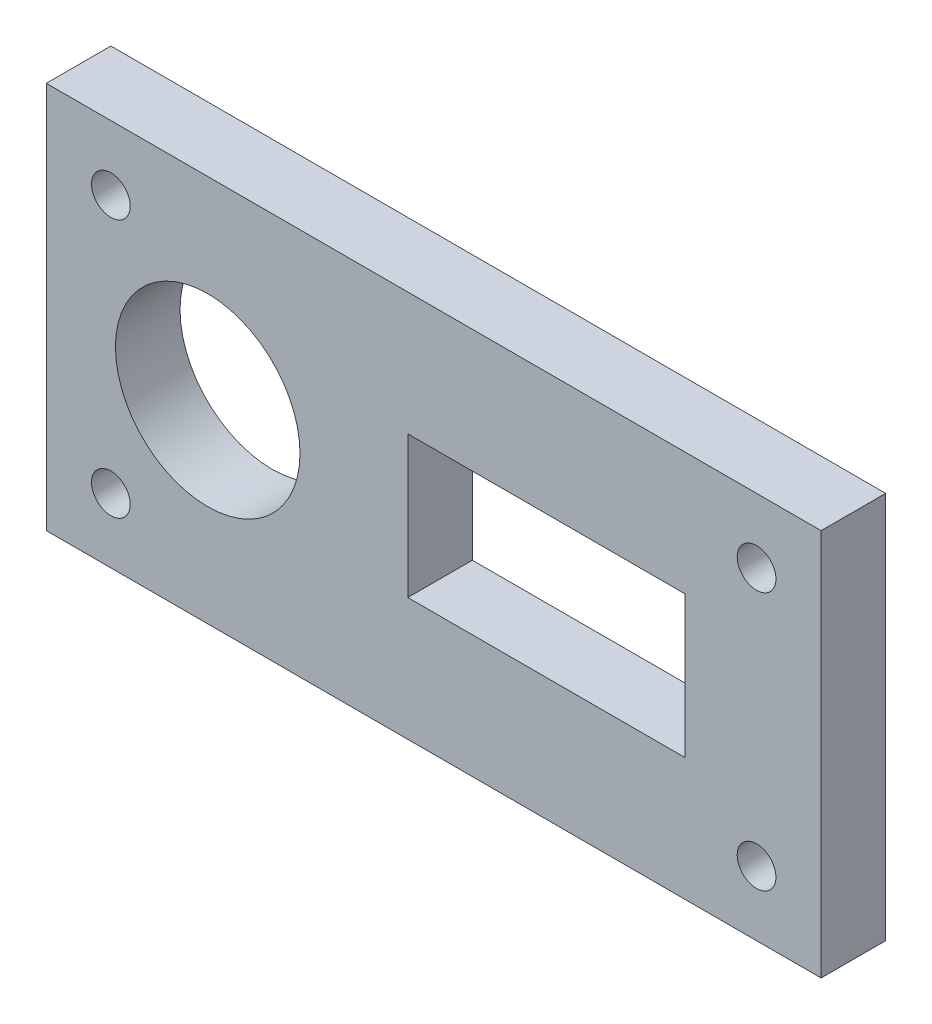
ISO-10303-21;
HEADER;
FILE_DESCRIPTION(('STEP AP214'),'2;1');
FILE_NAME('part.step','',(''),(''),'','','');
FILE_SCHEMA(('AUTOMOTIVE_DESIGN { 1 0 10303 214 1 1 1 1 }'));
ENDSEC;
DATA;
#1=APPLICATION_CONTEXT('core data for automotive mechanical design processes');
#2=APPLICATION_PROTOCOL_DEFINITION('international standard','automotive_design',2000,#1);
#3=PRODUCT_CONTEXT('',#1,'mechanical');
#4=PRODUCT('Part','Part','',(#3));
#5=PRODUCT_RELATED_PRODUCT_CATEGORY('part','',(#4));
#6=PRODUCT_DEFINITION_FORMATION('','',#4);
#7=PRODUCT_DEFINITION_CONTEXT('part definition',#1,'design');
#8=PRODUCT_DEFINITION('design','',#6,#7);
#9=PRODUCT_DEFINITION_SHAPE('','',#8);
#10=(LENGTH_UNIT() NAMED_UNIT(*) SI_UNIT(.MILLI.,.METRE.));
#11=(NAMED_UNIT(*) PLANE_ANGLE_UNIT() SI_UNIT($,.RADIAN.));
#12=(NAMED_UNIT(*) SI_UNIT($,.STERADIAN.) SOLID_ANGLE_UNIT());
#13=UNCERTAINTY_MEASURE_WITH_UNIT(LENGTH_MEASURE(1.E-05),#10,'distance_accuracy_value','');
#14=(GEOMETRIC_REPRESENTATION_CONTEXT(3) GLOBAL_UNCERTAINTY_ASSIGNED_CONTEXT((#13)) GLOBAL_UNIT_ASSIGNED_CONTEXT((#10,
#11,#12)) REPRESENTATION_CONTEXT('',''));
#15=CARTESIAN_POINT('',(0.,0.,0.));
#16=DIRECTION('',(0.,0.,1.));
#17=DIRECTION('',(1.,0.,0.));
#18=AXIS2_PLACEMENT_3D('',#15,#16,#17);
#19=CARTESIAN_POINT('',(60.,-30.,10.));
#20=DIRECTION('',(-1.,0.,0.));
#21=DIRECTION('',(0.,0.,1.));
#22=AXIS2_PLACEMENT_3D('',#19,#20,#21);
#23=PLANE('',#22);
#24=DIRECTION('',(0.,1.,0.));
#25=VECTOR('',#24,1.);
#26=CARTESIAN_POINT('',(60.,-30.,0.));
#27=LINE('',#26,#25);
#28=CARTESIAN_POINT('',(60.,-30.,0.));
#29=VERTEX_POINT('',#28);
#30=CARTESIAN_POINT('',(60.,30.,0.));
#31=VERTEX_POINT('',#30);
#32=EDGE_CURVE('E122',#29,#31,#27,.T.);
#33=ORIENTED_EDGE('',*,*,#32,.T.);
#34=DIRECTION('',(0.,0.,-1.));
#35=VECTOR('',#34,1.);
#36=CARTESIAN_POINT('',(60.,30.,10.));
#37=LINE('',#36,#35);
#38=CARTESIAN_POINT('',(60.,30.,10.));
#39=VERTEX_POINT('',#38);
#40=EDGE_CURVE('E11',#39,#31,#37,.T.);
#41=ORIENTED_EDGE('',*,*,#40,.F.);
#42=DIRECTION('',(0.,1.,0.));
#43=VECTOR('',#42,1.);
#44=CARTESIAN_POINT('',(60.,-30.,10.));
#45=LINE('',#44,#43);
#46=CARTESIAN_POINT('',(60.,-30.,10.));
#47=VERTEX_POINT('',#46);
#48=EDGE_CURVE('E123',#47,#39,#45,.T.);
#49=ORIENTED_EDGE('',*,*,#48,.F.);
#50=DIRECTION('',(0.,0.,-1.));
#51=VECTOR('',#50,1.);
#52=CARTESIAN_POINT('',(60.,-30.,10.));
#53=LINE('',#52,#51);
#54=EDGE_CURVE('E46',#47,#29,#53,.T.);
#55=ORIENTED_EDGE('',*,*,#54,.T.);
#56=EDGE_LOOP('',(#33,#41,#49,#55));
#57=FACE_BOUND('',#56,.T.);
#58=ADVANCED_FACE('F39',(#57),#23,.F.);
#59=CARTESIAN_POINT('',(-60.,30.,10.));
#60=DIRECTION('',(0.,-1.,0.));
#61=DIRECTION('',(0.,0.,-1.));
#62=AXIS2_PLACEMENT_3D('',#59,#60,#61);
#63=PLANE('',#62);
#64=DIRECTION('',(-1.,0.,0.));
#65=VECTOR('',#64,1.);
#66=CARTESIAN_POINT('',(-60.,30.,0.));
#67=LINE('',#66,#65);
#68=CARTESIAN_POINT('',(-60.0000000000003,30.,0.));
#69=VERTEX_POINT('',#68);
#70=EDGE_CURVE('E124',#31,#69,#67,.T.);
#71=ORIENTED_EDGE('',*,*,#70,.T.);
#72=DIRECTION('',(0.,0.,1.));
#73=VECTOR('',#72,1.);
#74=CARTESIAN_POINT('',(-60.0000000000003,30.,0.));
#75=LINE('',#74,#73);
#76=CARTESIAN_POINT('',(-60.0000000000003,30.,10.));
#77=VERTEX_POINT('',#76);
#78=EDGE_CURVE('E53',#69,#77,#75,.T.);
#79=ORIENTED_EDGE('',*,*,#78,.T.);
#80=DIRECTION('',(-1.,0.,0.));
#81=VECTOR('',#80,1.);
#82=CARTESIAN_POINT('',(-60.,30.,10.));
#83=LINE('',#82,#81);
#84=EDGE_CURVE('E127',#39,#77,#83,.T.);
#85=ORIENTED_EDGE('',*,*,#84,.F.);
#86=ORIENTED_EDGE('',*,*,#40,.T.);
#87=EDGE_LOOP('',(#71,#79,#85,#86));
#88=FACE_BOUND('',#87,.T.);
#89=ADVANCED_FACE('F257',(#88),#63,.F.);
#90=CARTESIAN_POINT('',(-60.,-30.,10.));
#91=DIRECTION('',(0.,1.,0.));
#92=DIRECTION('',(0.,0.,1.));
#93=AXIS2_PLACEMENT_3D('',#90,#91,#92);
#94=PLANE('',#93);
#95=DIRECTION('',(1.,0.,0.));
#96=VECTOR('',#95,1.);
#97=CARTESIAN_POINT('',(-60.,-30.,10.));
#98=LINE('',#97,#96);
#99=CARTESIAN_POINT('',(-60.0000000000003,-30.,10.));
#100=VERTEX_POINT('',#99);
#101=EDGE_CURVE('E116',#100,#47,#98,.T.);
#102=ORIENTED_EDGE('',*,*,#101,.F.);
#103=DIRECTION('',(0.,0.,1.));
#104=VECTOR('',#103,1.);
#105=CARTESIAN_POINT('',(-60.0000000000003,-30.,0.));
#106=LINE('',#105,#104);
#107=CARTESIAN_POINT('',(-60.0000000000003,-30.,0.));
#108=VERTEX_POINT('',#107);
#109=EDGE_CURVE('E103',#108,#100,#106,.T.);
#110=ORIENTED_EDGE('',*,*,#109,.F.);
#111=DIRECTION('',(1.,0.,0.));
#112=VECTOR('',#111,1.);
#113=CARTESIAN_POINT('',(-60.,-30.,0.));
#114=LINE('',#113,#112);
#115=EDGE_CURVE('E114',#108,#29,#114,.T.);
#116=ORIENTED_EDGE('',*,*,#115,.T.);
#117=ORIENTED_EDGE('',*,*,#54,.F.);
#118=EDGE_LOOP('',(#102,#110,#116,#117));
#119=FACE_BOUND('',#118,.T.);
#120=ADVANCED_FACE('F112',(#119),#94,.F.);
#121=CARTESIAN_POINT('',(0.,0.,10.));
#122=DIRECTION('',(0.,0.,-1.));
#123=DIRECTION('',(-1.,0.,0.));
#124=AXIS2_PLACEMENT_3D('',#121,#122,#123);
#125=PLANE('',#124);
#126=CARTESIAN_POINT('',(50.0000000000017,-19.9999999999999,10.));
#127=DIRECTION('',(0.,0.,-1.));
#128=DIRECTION('',(-1.,0.,0.));
#129=AXIS2_PLACEMENT_3D('',#126,#127,#128);
#130=CIRCLE('',#129,3.);
#131=CARTESIAN_POINT('',(47.0000000000017,-19.9999999999999,10.));
#132=VERTEX_POINT('',#131);
#133=EDGE_CURVE('E213',#132,#132,#130,.T.);
#134=ORIENTED_EDGE('',*,*,#133,.T.);
#135=EDGE_LOOP('',(#134));
#136=FACE_BOUND('',#135,.T.);
#137=CARTESIAN_POINT('',(-49.9999999999983,-19.9999999999999,10.));
#138=DIRECTION('',(0.,0.,-1.));
#139=DIRECTION('',(-1.,0.,0.));
#140=AXIS2_PLACEMENT_3D('',#137,#138,#139);
#141=CIRCLE('',#140,3.);
#142=CARTESIAN_POINT('',(-52.9999999999983,-19.9999999999999,10.));
#143=VERTEX_POINT('',#142);
#144=EDGE_CURVE('E219',#143,#143,#141,.T.);
#145=ORIENTED_EDGE('',*,*,#144,.T.);
#146=EDGE_LOOP('',(#145));
#147=FACE_BOUND('',#146,.T.);
#148=CARTESIAN_POINT('',(-49.9999999999983,20.0000000000001,10.));
#149=DIRECTION('',(0.,0.,-1.));
#150=DIRECTION('',(-1.,0.,0.));
#151=AXIS2_PLACEMENT_3D('',#148,#149,#150);
#152=CIRCLE('',#151,3.);
#153=CARTESIAN_POINT('',(-52.9999999999983,20.0000000000001,10.));
#154=VERTEX_POINT('',#153);
#155=EDGE_CURVE('E207',#154,#154,#152,.T.);
#156=ORIENTED_EDGE('',*,*,#155,.T.);
#157=EDGE_LOOP('',(#156));
#158=FACE_BOUND('',#157,.T.);
#159=CARTESIAN_POINT('',(50.0000000000017,20.0000000000001,10.));
#160=DIRECTION('',(0.,0.,-1.));
#161=DIRECTION('',(-1.,0.,0.));
#162=AXIS2_PLACEMENT_3D('',#159,#160,#161);
#163=CIRCLE('',#162,3.);
#164=CARTESIAN_POINT('',(47.0000000000017,20.0000000000001,10.));
#165=VERTEX_POINT('',#164);
#166=EDGE_CURVE('E202',#165,#165,#163,.T.);
#167=ORIENTED_EDGE('',*,*,#166,.T.);
#168=EDGE_LOOP('',(#167));
#169=FACE_BOUND('',#168,.T.);
#170=DIRECTION('',(-1.,0.,0.));
#171=VECTOR('',#170,1.);
#172=CARTESIAN_POINT('',(38.9394239388569,-10.9786239388569,10.));
#173=LINE('',#172,#171);
#174=CARTESIAN_POINT('',(38.9394239388569,-10.9786239388569,10.));
#175=VERTEX_POINT('',#174);
#176=CARTESIAN_POINT('',(-4.0178239388569,-10.9786239388569,10.));
#177=VERTEX_POINT('',#176);
#178=EDGE_CURVE('E152',#175,#177,#173,.T.);
#179=ORIENTED_EDGE('',*,*,#178,.T.);
#180=DIRECTION('',(0.,1.,0.));
#181=VECTOR('',#180,1.);
#182=CARTESIAN_POINT('',(-4.0178239388569,-10.9786239388569,10.));
#183=LINE('',#182,#181);
#184=CARTESIAN_POINT('',(-4.0178239388569,10.9786239388569,10.));
#185=VERTEX_POINT('',#184);
#186=EDGE_CURVE('E160',#177,#185,#183,.T.);
#187=ORIENTED_EDGE('',*,*,#186,.T.);
#188=DIRECTION('',(1.,0.,0.));
#189=VECTOR('',#188,1.);
#190=CARTESIAN_POINT('',(38.9394239388569,10.9786239388569,10.));
#191=LINE('',#190,#189);
#192=CARTESIAN_POINT('',(38.9394239388569,10.9786239388569,10.));
#193=VERTEX_POINT('',#192);
#194=EDGE_CURVE('E173',#185,#193,#191,.T.);
#195=ORIENTED_EDGE('',*,*,#194,.T.);
#196=DIRECTION('',(0.,-1.,0.));
#197=VECTOR('',#196,1.);
#198=CARTESIAN_POINT('',(38.9394239388569,-10.9786239388569,10.));
#199=LINE('',#198,#197);
#200=EDGE_CURVE('E61',#193,#175,#199,.T.);
#201=ORIENTED_EDGE('',*,*,#200,.T.);
#202=EDGE_LOOP('',(#179,#187,#195,#201));
#203=FACE_BOUND('',#202,.T.);
#204=CARTESIAN_POINT('',(-35.,0.,10.));
#205=DIRECTION('',(0.,0.,1.));
#206=DIRECTION('',(1.,0.,0.));
#207=AXIS2_PLACEMENT_3D('',#204,#205,#206);
#208=CIRCLE('',#207,14.29);
#209=CARTESIAN_POINT('',(-20.71,0.,10.));
#210=VERTEX_POINT('',#209);
#211=EDGE_CURVE('E140',#210,#210,#208,.T.);
#212=ORIENTED_EDGE('',*,*,#211,.F.);
#213=EDGE_LOOP('',(#212));
#214=FACE_BOUND('',#213,.T.);
#215=ORIENTED_EDGE('',*,*,#84,.T.);
#216=DIRECTION('',(0.,1.,0.));
#217=VECTOR('',#216,1.);
#218=CARTESIAN_POINT('',(-60.0000000000003,30.,10.));
#219=LINE('',#218,#217);
#220=EDGE_CURVE('E108',#100,#77,#219,.T.);
#221=ORIENTED_EDGE('',*,*,#220,.F.);
#222=ORIENTED_EDGE('',*,*,#101,.T.);
#223=ORIENTED_EDGE('',*,*,#48,.T.);
#224=EDGE_LOOP('',(#215,#221,#222,#223));
#225=FACE_BOUND('',#224,.T.);
#226=ADVANCED_FACE('F228',(#136,#147,#158,#169,#203,#214,#225),#125,.F.);
#227=CARTESIAN_POINT('',(0.,0.,0.));
#228=DIRECTION('',(0.,0.,-1.));
#229=DIRECTION('',(-1.,0.,0.));
#230=AXIS2_PLACEMENT_3D('',#227,#228,#229);
#231=PLANE('',#230);
#232=CARTESIAN_POINT('',(50.0000000000017,-19.9999999999999,0.));
#233=DIRECTION('',(0.,0.,-1.));
#234=DIRECTION('',(-1.,0.,0.));
#235=AXIS2_PLACEMENT_3D('',#232,#233,#234);
#236=CIRCLE('',#235,3.);
#237=CARTESIAN_POINT('',(47.0000000000017,-19.9999999999999,0.));
#238=VERTEX_POINT('',#237);
#239=EDGE_CURVE('E210',#238,#238,#236,.T.);
#240=ORIENTED_EDGE('',*,*,#239,.F.);
#241=EDGE_LOOP('',(#240));
#242=FACE_BOUND('',#241,.T.);
#243=CARTESIAN_POINT('',(-49.9999999999983,-19.9999999999999,0.));
#244=DIRECTION('',(0.,0.,-1.));
#245=DIRECTION('',(-1.,0.,0.));
#246=AXIS2_PLACEMENT_3D('',#243,#244,#245);
#247=CIRCLE('',#246,3.);
#248=CARTESIAN_POINT('',(-52.9999999999983,-19.9999999999999,0.));
#249=VERTEX_POINT('',#248);
#250=EDGE_CURVE('E216',#249,#249,#247,.T.);
#251=ORIENTED_EDGE('',*,*,#250,.F.);
#252=EDGE_LOOP('',(#251));
#253=FACE_BOUND('',#252,.T.);
#254=CARTESIAN_POINT('',(-49.9999999999983,20.0000000000001,0.));
#255=DIRECTION('',(0.,0.,-1.));
#256=DIRECTION('',(-1.,0.,0.));
#257=AXIS2_PLACEMENT_3D('',#254,#255,#256);
#258=CIRCLE('',#257,3.);
#259=CARTESIAN_POINT('',(-52.9999999999983,20.0000000000001,0.));
#260=VERTEX_POINT('',#259);
#261=EDGE_CURVE('E222',#260,#260,#258,.T.);
#262=ORIENTED_EDGE('',*,*,#261,.F.);
#263=EDGE_LOOP('',(#262));
#264=FACE_BOUND('',#263,.T.);
#265=CARTESIAN_POINT('',(50.0000000000017,20.0000000000001,0.));
#266=DIRECTION('',(0.,0.,-1.));
#267=DIRECTION('',(-1.,0.,0.));
#268=AXIS2_PLACEMENT_3D('',#265,#266,#267);
#269=CIRCLE('',#268,3.);
#270=CARTESIAN_POINT('',(47.0000000000017,20.0000000000001,0.));
#271=VERTEX_POINT('',#270);
#272=EDGE_CURVE('E204',#271,#271,#269,.T.);
#273=ORIENTED_EDGE('',*,*,#272,.F.);
#274=EDGE_LOOP('',(#273));
#275=FACE_BOUND('',#274,.T.);
#276=DIRECTION('',(0.,1.,0.));
#277=VECTOR('',#276,1.);
#278=CARTESIAN_POINT('',(-60.0000000000003,30.,0.));
#279=LINE('',#278,#277);
#280=EDGE_CURVE('E100',#108,#69,#279,.T.);
#281=ORIENTED_EDGE('',*,*,#280,.T.);
#282=ORIENTED_EDGE('',*,*,#70,.F.);
#283=ORIENTED_EDGE('',*,*,#32,.F.);
#284=ORIENTED_EDGE('',*,*,#115,.F.);
#285=EDGE_LOOP('',(#281,#282,#283,#284));
#286=FACE_BOUND('',#285,.T.);
#287=CARTESIAN_POINT('',(41.8608,-4.99999999999999,0.));
#288=DIRECTION('',(0.,0.,-1.));
#289=DIRECTION('',(-1.,0.,0.));
#290=AXIS2_PLACEMENT_3D('',#287,#288,#289);
#291=CIRCLE('',#290,1.5);
#292=CARTESIAN_POINT('',(40.3608,-4.99999999999999,0.));
#293=VERTEX_POINT('',#292);
#294=EDGE_CURVE('E184',#293,#293,#291,.T.);
#295=ORIENTED_EDGE('',*,*,#294,.F.);
#296=EDGE_LOOP('',(#295));
#297=FACE_BOUND('',#296,.T.);
#298=CARTESIAN_POINT('',(-6.9392,-5.,0.));
#299=DIRECTION('',(0.,0.,-1.));
#300=DIRECTION('',(-1.,0.,0.));
#301=AXIS2_PLACEMENT_3D('',#298,#299,#300);
#302=CIRCLE('',#301,1.5);
#303=CARTESIAN_POINT('',(-8.4392,-5.,0.));
#304=VERTEX_POINT('',#303);
#305=EDGE_CURVE('E190',#304,#304,#302,.T.);
#306=ORIENTED_EDGE('',*,*,#305,.F.);
#307=EDGE_LOOP('',(#306));
#308=FACE_BOUND('',#307,.T.);
#309=CARTESIAN_POINT('',(-6.9392,5.,0.));
#310=DIRECTION('',(0.,0.,-1.));
#311=DIRECTION('',(-1.,0.,0.));
#312=AXIS2_PLACEMENT_3D('',#309,#310,#311);
#313=CIRCLE('',#312,1.5);
#314=CARTESIAN_POINT('',(-8.4392,5.,0.));
#315=VERTEX_POINT('',#314);
#316=EDGE_CURVE('E196',#315,#315,#313,.T.);
#317=ORIENTED_EDGE('',*,*,#316,.F.);
#318=EDGE_LOOP('',(#317));
#319=FACE_BOUND('',#318,.T.);
#320=CARTESIAN_POINT('',(41.8608,5.00000000000001,0.));
#321=DIRECTION('',(0.,0.,-1.));
#322=DIRECTION('',(-1.,0.,0.));
#323=AXIS2_PLACEMENT_3D('',#320,#321,#322);
#324=CIRCLE('',#323,1.5);
#325=CARTESIAN_POINT('',(40.3608,5.00000000000001,0.));
#326=VERTEX_POINT('',#325);
#327=EDGE_CURVE('E178',#326,#326,#324,.T.);
#328=ORIENTED_EDGE('',*,*,#327,.F.);
#329=EDGE_LOOP('',(#328));
#330=FACE_BOUND('',#329,.T.);
#331=DIRECTION('',(0.,1.,0.));
#332=VECTOR('',#331,1.);
#333=CARTESIAN_POINT('',(-4.0178239388569,-10.9786239388569,0.));
#334=LINE('',#333,#332);
#335=CARTESIAN_POINT('',(-4.0178239388569,-10.9786239388569,0.));
#336=VERTEX_POINT('',#335);
#337=CARTESIAN_POINT('',(-4.0178239388569,10.9786239388569,0.));
#338=VERTEX_POINT('',#337);
#339=EDGE_CURVE('E167',#336,#338,#334,.T.);
#340=ORIENTED_EDGE('',*,*,#339,.F.);
#341=DIRECTION('',(-1.,0.,0.));
#342=VECTOR('',#341,1.);
#343=CARTESIAN_POINT('',(38.9394239388569,-10.9786239388569,0.));
#344=LINE('',#343,#342);
#345=CARTESIAN_POINT('',(38.9394239388569,-10.9786239388569,0.));
#346=VERTEX_POINT('',#345);
#347=EDGE_CURVE('E157',#346,#336,#344,.T.);
#348=ORIENTED_EDGE('',*,*,#347,.F.);
#349=DIRECTION('',(0.,-1.,0.));
#350=VECTOR('',#349,1.);
#351=CARTESIAN_POINT('',(38.9394239388569,-10.9786239388569,0.));
#352=LINE('',#351,#350);
#353=CARTESIAN_POINT('',(38.9394239388569,10.9786239388569,0.));
#354=VERTEX_POINT('',#353);
#355=EDGE_CURVE('E161',#354,#346,#352,.T.);
#356=ORIENTED_EDGE('',*,*,#355,.F.);
#357=DIRECTION('',(1.,0.,0.));
#358=VECTOR('',#357,1.);
#359=CARTESIAN_POINT('',(38.9394239388569,10.9786239388569,0.));
#360=LINE('',#359,#358);
#361=EDGE_CURVE('E164',#338,#354,#360,.T.);
#362=ORIENTED_EDGE('',*,*,#361,.F.);
#363=EDGE_LOOP('',(#340,#348,#356,#362));
#364=FACE_BOUND('',#363,.T.);
#365=CARTESIAN_POINT('',(-35.,0.,0.));
#366=DIRECTION('',(0.,0.,1.));
#367=DIRECTION('',(1.,0.,0.));
#368=AXIS2_PLACEMENT_3D('',#365,#366,#367);
#369=CIRCLE('',#368,14.29);
#370=CARTESIAN_POINT('',(-20.71,0.,0.));
#371=VERTEX_POINT('',#370);
#372=EDGE_CURVE('E137',#371,#371,#369,.T.);
#373=ORIENTED_EDGE('',*,*,#372,.T.);
#374=EDGE_LOOP('',(#373));
#375=FACE_BOUND('',#374,.T.);
#376=ADVANCED_FACE('F119',(#242,#253,#264,#275,#286,#297,#308,#319,#330,#364,#375),#231,.T.);
#377=CARTESIAN_POINT('',(-35.,0.,0.));
#378=DIRECTION('',(0.,0.,1.));
#379=DIRECTION('',(1.,0.,0.));
#380=AXIS2_PLACEMENT_3D('',#377,#378,#379);
#381=CYLINDRICAL_SURFACE('',#380,14.29);
#382=ORIENTED_EDGE('',*,*,#372,.F.);
#383=EDGE_LOOP('',(#382));
#384=FACE_BOUND('',#383,.T.);
#385=ORIENTED_EDGE('',*,*,#211,.T.);
#386=EDGE_LOOP('',(#385));
#387=FACE_BOUND('',#386,.T.);
#388=ADVANCED_FACE('F241',(#384,#387),#381,.F.);
#389=CARTESIAN_POINT('',(-4.0178239388569,-10.9786239388569,10.));
#390=DIRECTION('',(-1.,0.,0.));
#391=DIRECTION('',(0.,0.,1.));
#392=AXIS2_PLACEMENT_3D('',#389,#390,#391);
#393=PLANE('',#392);
#394=ORIENTED_EDGE('',*,*,#339,.T.);
#395=DIRECTION('',(0.,0.,-1.));
#396=VECTOR('',#395,1.);
#397=CARTESIAN_POINT('',(-4.0178239388569,10.9786239388569,10.));
#398=LINE('',#397,#396);
#399=EDGE_CURVE('E148',#185,#338,#398,.T.);
#400=ORIENTED_EDGE('',*,*,#399,.F.);
#401=ORIENTED_EDGE('',*,*,#186,.F.);
#402=DIRECTION('',(0.,0.,-1.));
#403=VECTOR('',#402,1.);
#404=CARTESIAN_POINT('',(-4.0178239388569,-10.9786239388569,10.));
#405=LINE('',#404,#403);
#406=EDGE_CURVE('E145',#177,#336,#405,.T.);
#407=ORIENTED_EDGE('',*,*,#406,.T.);
#408=EDGE_LOOP('',(#394,#400,#401,#407));
#409=FACE_BOUND('',#408,.T.);
#410=ADVANCED_FACE('F273',(#409),#393,.F.);
#411=CARTESIAN_POINT('',(38.9394239388569,-10.9786239388569,10.));
#412=DIRECTION('',(0.,-1.,0.));
#413=DIRECTION('',(0.,0.,-1.));
#414=AXIS2_PLACEMENT_3D('',#411,#412,#413);
#415=PLANE('',#414);
#416=ORIENTED_EDGE('',*,*,#347,.T.);
#417=ORIENTED_EDGE('',*,*,#406,.F.);
#418=ORIENTED_EDGE('',*,*,#178,.F.);
#419=DIRECTION('',(0.,0.,-1.));
#420=VECTOR('',#419,1.);
#421=CARTESIAN_POINT('',(38.9394239388569,-10.9786239388569,10.));
#422=LINE('',#421,#420);
#423=EDGE_CURVE('E154',#175,#346,#422,.T.);
#424=ORIENTED_EDGE('',*,*,#423,.T.);
#425=EDGE_LOOP('',(#416,#417,#418,#424));
#426=FACE_BOUND('',#425,.T.);
#427=ADVANCED_FACE('F277',(#426),#415,.F.);
#428=CARTESIAN_POINT('',(38.9394239388569,-10.9786239388569,10.));
#429=DIRECTION('',(1.,0.,0.));
#430=DIRECTION('',(0.,0.,-1.));
#431=AXIS2_PLACEMENT_3D('',#428,#429,#430);
#432=PLANE('',#431);
#433=ORIENTED_EDGE('',*,*,#355,.T.);
#434=ORIENTED_EDGE('',*,*,#423,.F.);
#435=ORIENTED_EDGE('',*,*,#200,.F.);
#436=DIRECTION('',(0.,0.,-1.));
#437=VECTOR('',#436,1.);
#438=CARTESIAN_POINT('',(38.9394239388569,10.9786239388569,10.));
#439=LINE('',#438,#437);
#440=EDGE_CURVE('E151',#193,#354,#439,.T.);
#441=ORIENTED_EDGE('',*,*,#440,.T.);
#442=EDGE_LOOP('',(#433,#434,#435,#441));
#443=FACE_BOUND('',#442,.T.);
#444=ADVANCED_FACE('F283',(#443),#432,.F.);
#445=CARTESIAN_POINT('',(38.9394239388569,10.9786239388569,10.));
#446=DIRECTION('',(0.,1.,0.));
#447=DIRECTION('',(0.,0.,1.));
#448=AXIS2_PLACEMENT_3D('',#445,#446,#447);
#449=PLANE('',#448);
#450=ORIENTED_EDGE('',*,*,#361,.T.);
#451=ORIENTED_EDGE('',*,*,#440,.F.);
#452=ORIENTED_EDGE('',*,*,#194,.F.);
#453=ORIENTED_EDGE('',*,*,#399,.T.);
#454=EDGE_LOOP('',(#450,#451,#452,#453));
#455=FACE_BOUND('',#454,.T.);
#456=ADVANCED_FACE('F279',(#455),#449,.F.);
#457=CARTESIAN_POINT('',(41.8608,5.00000000000001,8.));
#458=DIRECTION('',(0.,0.,-1.));
#459=DIRECTION('',(-1.,0.,0.));
#460=AXIS2_PLACEMENT_3D('',#457,#458,#459);
#461=CYLINDRICAL_SURFACE('',#460,1.5);
#462=CARTESIAN_POINT('',(41.8608,5.00000000000001,8.));
#463=DIRECTION('',(0.,0.,-1.));
#464=DIRECTION('',(-1.,0.,0.));
#465=AXIS2_PLACEMENT_3D('',#462,#463,#464);
#466=CIRCLE('',#465,1.5);
#467=CARTESIAN_POINT('',(40.3608,5.00000000000001,8.));
#468=VERTEX_POINT('',#467);
#469=EDGE_CURVE('E169',#468,#468,#466,.T.);
#470=ORIENTED_EDGE('',*,*,#469,.F.);
#471=EDGE_LOOP('',(#470));
#472=FACE_BOUND('',#471,.T.);
#473=ORIENTED_EDGE('',*,*,#327,.T.);
#474=EDGE_LOOP('',(#473));
#475=FACE_BOUND('',#474,.T.);
#476=ADVANCED_FACE('F282',(#472,#475),#461,.F.);
#477=CARTESIAN_POINT('',(41.8608,5.00000000000001,8.));
#478=DIRECTION('',(0.,0.,-1.));
#479=DIRECTION('',(-1.,0.,0.));
#480=AXIS2_PLACEMENT_3D('',#477,#478,#479);
#481=PLANE('',#480);
#482=ORIENTED_EDGE('',*,*,#469,.T.);
#483=EDGE_LOOP('',(#482));
#484=FACE_BOUND('',#483,.T.);
#485=ADVANCED_FACE('F292',(#484),#481,.T.);
#486=CARTESIAN_POINT('',(-6.9392,5.,8.));
#487=DIRECTION('',(0.,0.,-1.));
#488=DIRECTION('',(-1.,0.,0.));
#489=AXIS2_PLACEMENT_3D('',#486,#487,#488);
#490=CYLINDRICAL_SURFACE('',#489,1.5);
#491=CARTESIAN_POINT('',(-6.9392,5.,8.));
#492=DIRECTION('',(0.,0.,-1.));
#493=DIRECTION('',(-1.,0.,0.));
#494=AXIS2_PLACEMENT_3D('',#491,#492,#493);
#495=CIRCLE('',#494,1.5);
#496=CARTESIAN_POINT('',(-8.4392,5.,8.));
#497=VERTEX_POINT('',#496);
#498=EDGE_CURVE('E181',#497,#497,#495,.T.);
#499=ORIENTED_EDGE('',*,*,#498,.F.);
#500=EDGE_LOOP('',(#499));
#501=FACE_BOUND('',#500,.T.);
#502=ORIENTED_EDGE('',*,*,#316,.T.);
#503=EDGE_LOOP('',(#502));
#504=FACE_BOUND('',#503,.T.);
#505=ADVANCED_FACE('F296',(#501,#504),#490,.F.);
#506=CARTESIAN_POINT('',(-6.9392,5.,8.));
#507=DIRECTION('',(0.,0.,-1.));
#508=DIRECTION('',(-1.,0.,0.));
#509=AXIS2_PLACEMENT_3D('',#506,#507,#508);
#510=PLANE('',#509);
#511=ORIENTED_EDGE('',*,*,#498,.T.);
#512=EDGE_LOOP('',(#511));
#513=FACE_BOUND('',#512,.T.);
#514=ADVANCED_FACE('F309',(#513),#510,.T.);
#515=CARTESIAN_POINT('',(-6.9392,-5.,8.));
#516=DIRECTION('',(0.,0.,-1.));
#517=DIRECTION('',(-1.,0.,0.));
#518=AXIS2_PLACEMENT_3D('',#515,#516,#517);
#519=CYLINDRICAL_SURFACE('',#518,1.5);
#520=CARTESIAN_POINT('',(-6.9392,-5.,8.));
#521=DIRECTION('',(0.,0.,-1.));
#522=DIRECTION('',(-1.,0.,0.));
#523=AXIS2_PLACEMENT_3D('',#520,#521,#522);
#524=CIRCLE('',#523,1.5);
#525=CARTESIAN_POINT('',(-8.4392,-5.,8.));
#526=VERTEX_POINT('',#525);
#527=EDGE_CURVE('E193',#526,#526,#524,.T.);
#528=ORIENTED_EDGE('',*,*,#527,.F.);
#529=EDGE_LOOP('',(#528));
#530=FACE_BOUND('',#529,.T.);
#531=ORIENTED_EDGE('',*,*,#305,.T.);
#532=EDGE_LOOP('',(#531));
#533=FACE_BOUND('',#532,.T.);
#534=ADVANCED_FACE('F306',(#530,#533),#519,.F.);
#535=CARTESIAN_POINT('',(-6.9392,-5.,8.));
#536=DIRECTION('',(0.,0.,-1.));
#537=DIRECTION('',(-1.,0.,0.));
#538=AXIS2_PLACEMENT_3D('',#535,#536,#537);
#539=PLANE('',#538);
#540=ORIENTED_EDGE('',*,*,#527,.T.);
#541=EDGE_LOOP('',(#540));
#542=FACE_BOUND('',#541,.T.);
#543=ADVANCED_FACE('F301',(#542),#539,.T.);
#544=CARTESIAN_POINT('',(41.8608,-4.99999999999999,8.));
#545=DIRECTION('',(0.,0.,-1.));
#546=DIRECTION('',(-1.,0.,0.));
#547=AXIS2_PLACEMENT_3D('',#544,#545,#546);
#548=CYLINDRICAL_SURFACE('',#547,1.5);
#549=CARTESIAN_POINT('',(41.8608,-4.99999999999999,8.));
#550=DIRECTION('',(0.,0.,-1.));
#551=DIRECTION('',(-1.,0.,0.));
#552=AXIS2_PLACEMENT_3D('',#549,#550,#551);
#553=CIRCLE('',#552,1.5);
#554=CARTESIAN_POINT('',(40.3608,-4.99999999999999,8.));
#555=VERTEX_POINT('',#554);
#556=EDGE_CURVE('E187',#555,#555,#553,.T.);
#557=ORIENTED_EDGE('',*,*,#556,.F.);
#558=EDGE_LOOP('',(#557));
#559=FACE_BOUND('',#558,.T.);
#560=ORIENTED_EDGE('',*,*,#294,.T.);
#561=EDGE_LOOP('',(#560));
#562=FACE_BOUND('',#561,.T.);
#563=ADVANCED_FACE('F298',(#559,#562),#548,.F.);
#564=CARTESIAN_POINT('',(41.8608,-4.99999999999999,8.));
#565=DIRECTION('',(0.,0.,-1.));
#566=DIRECTION('',(-1.,0.,0.));
#567=AXIS2_PLACEMENT_3D('',#564,#565,#566);
#568=PLANE('',#567);
#569=ORIENTED_EDGE('',*,*,#556,.T.);
#570=EDGE_LOOP('',(#569));
#571=FACE_BOUND('',#570,.T.);
#572=ADVANCED_FACE('F252',(#571),#568,.T.);
#573=CARTESIAN_POINT('',(-60.0000000000003,30.,0.));
#574=DIRECTION('',(1.,0.,0.));
#575=DIRECTION('',(0.,0.,-1.));
#576=AXIS2_PLACEMENT_3D('',#573,#574,#575);
#577=PLANE('',#576);
#578=ORIENTED_EDGE('',*,*,#220,.T.);
#579=ORIENTED_EDGE('',*,*,#78,.F.);
#580=ORIENTED_EDGE('',*,*,#280,.F.);
#581=ORIENTED_EDGE('',*,*,#109,.T.);
#582=EDGE_LOOP('',(#578,#579,#580,#581));
#583=FACE_BOUND('',#582,.T.);
#584=ADVANCED_FACE('F102',(#583),#577,.F.);
#585=CARTESIAN_POINT('',(50.0000000000017,20.0000000000001,10.));
#586=DIRECTION('',(0.,0.,-1.));
#587=DIRECTION('',(-1.,0.,0.));
#588=AXIS2_PLACEMENT_3D('',#585,#586,#587);
#589=CYLINDRICAL_SURFACE('',#588,3.);
#590=ORIENTED_EDGE('',*,*,#166,.F.);
#591=EDGE_LOOP('',(#590));
#592=FACE_BOUND('',#591,.T.);
#593=ORIENTED_EDGE('',*,*,#272,.T.);
#594=EDGE_LOOP('',(#593));
#595=FACE_BOUND('',#594,.T.);
#596=ADVANCED_FACE('F235',(#592,#595),#589,.F.);
#597=CARTESIAN_POINT('',(-49.9999999999983,20.0000000000001,10.));
#598=DIRECTION('',(0.,0.,-1.));
#599=DIRECTION('',(-1.,0.,0.));
#600=AXIS2_PLACEMENT_3D('',#597,#598,#599);
#601=CYLINDRICAL_SURFACE('',#600,3.);
#602=ORIENTED_EDGE('',*,*,#155,.F.);
#603=EDGE_LOOP('',(#602));
#604=FACE_BOUND('',#603,.T.);
#605=ORIENTED_EDGE('',*,*,#261,.T.);
#606=EDGE_LOOP('',(#605));
#607=FACE_BOUND('',#606,.T.);
#608=ADVANCED_FACE('F231',(#604,#607),#601,.F.);
#609=CARTESIAN_POINT('',(-49.9999999999983,-19.9999999999999,10.));
#610=DIRECTION('',(0.,0.,-1.));
#611=DIRECTION('',(-1.,0.,0.));
#612=AXIS2_PLACEMENT_3D('',#609,#610,#611);
#613=CYLINDRICAL_SURFACE('',#612,3.);
#614=ORIENTED_EDGE('',*,*,#144,.F.);
#615=EDGE_LOOP('',(#614));
#616=FACE_BOUND('',#615,.T.);
#617=ORIENTED_EDGE('',*,*,#250,.T.);
#618=EDGE_LOOP('',(#617));
#619=FACE_BOUND('',#618,.T.);
#620=ADVANCED_FACE('F234',(#616,#619),#613,.F.);
#621=CARTESIAN_POINT('',(50.0000000000017,-19.9999999999999,10.));
#622=DIRECTION('',(0.,0.,-1.));
#623=DIRECTION('',(-1.,0.,0.));
#624=AXIS2_PLACEMENT_3D('',#621,#622,#623);
#625=CYLINDRICAL_SURFACE('',#624,3.);
#626=ORIENTED_EDGE('',*,*,#133,.F.);
#627=EDGE_LOOP('',(#626));
#628=FACE_BOUND('',#627,.T.);
#629=ORIENTED_EDGE('',*,*,#239,.T.);
#630=EDGE_LOOP('',(#629));
#631=FACE_BOUND('',#630,.T.);
#632=ADVANCED_FACE('F390',(#628,#631),#625,.F.);
#633=CLOSED_SHELL('',(#58,#89,#120,#226,#376,#388,#410,#427,#444,#456,#476,#485,#505,#514,#534,
#543,#563,#572,#584,#596,#608,#620,#632));
#634=MANIFOLD_SOLID_BREP('B2',#633);
#635=ADVANCED_BREP_SHAPE_REPRESENTATION('',(#18,#634),#14);
#636=SHAPE_DEFINITION_REPRESENTATION(#9,#635);
ENDSEC;
END-ISO-10303-21;
